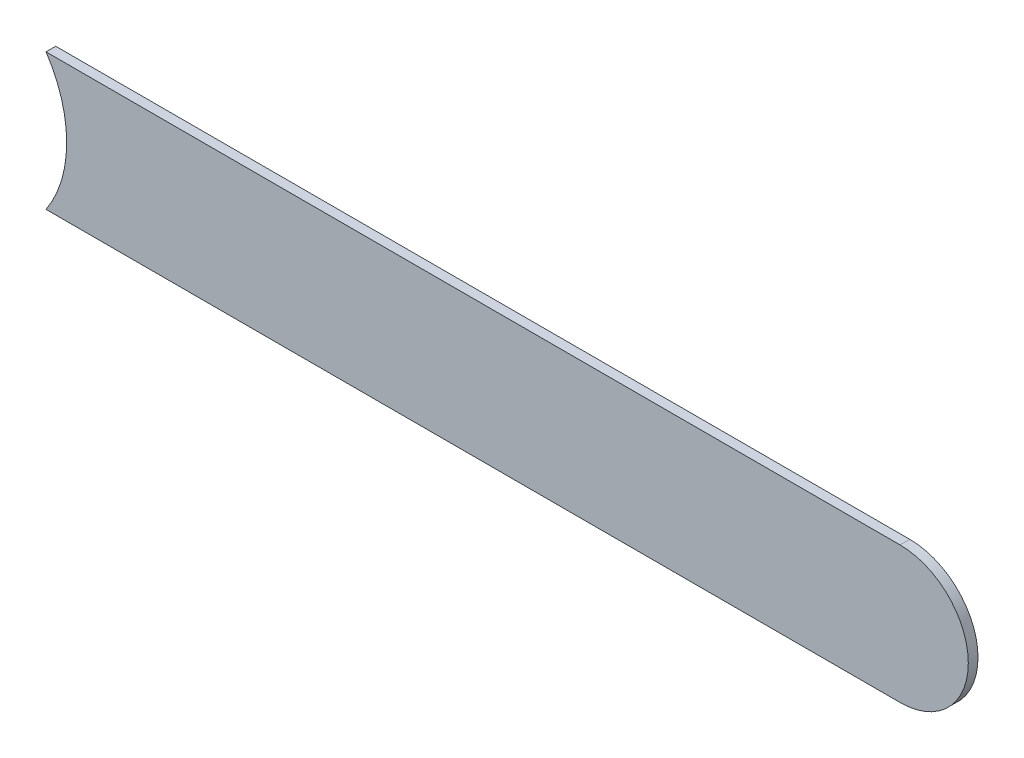
ISO-10303-21;
HEADER;
FILE_DESCRIPTION(('STEP AP214'),'2;1');
FILE_NAME('part.step','',(''),(''),'','','');
FILE_SCHEMA(('AUTOMOTIVE_DESIGN { 1 0 10303 214 1 1 1 1 }'));
ENDSEC;
DATA;
#1=APPLICATION_CONTEXT('core data for automotive mechanical design processes');
#2=APPLICATION_PROTOCOL_DEFINITION('international standard','automotive_design',2000,#1);
#3=PRODUCT_CONTEXT('',#1,'mechanical');
#4=PRODUCT('Part','Part','',(#3));
#5=PRODUCT_RELATED_PRODUCT_CATEGORY('part','',(#4));
#6=PRODUCT_DEFINITION_FORMATION('','',#4);
#7=PRODUCT_DEFINITION_CONTEXT('part definition',#1,'design');
#8=PRODUCT_DEFINITION('design','',#6,#7);
#9=PRODUCT_DEFINITION_SHAPE('','',#8);
#10=(LENGTH_UNIT() NAMED_UNIT(*) SI_UNIT(.MILLI.,.METRE.));
#11=(NAMED_UNIT(*) PLANE_ANGLE_UNIT() SI_UNIT($,.RADIAN.));
#12=(NAMED_UNIT(*) SI_UNIT($,.STERADIAN.) SOLID_ANGLE_UNIT());
#13=UNCERTAINTY_MEASURE_WITH_UNIT(LENGTH_MEASURE(1.E-05),#10,'distance_accuracy_value','');
#14=(GEOMETRIC_REPRESENTATION_CONTEXT(3) GLOBAL_UNCERTAINTY_ASSIGNED_CONTEXT((#13)) GLOBAL_UNIT_ASSIGNED_CONTEXT((#10,
#11,#12)) REPRESENTATION_CONTEXT('',''));
#15=CARTESIAN_POINT('',(0.,0.,0.));
#16=DIRECTION('',(0.,0.,1.));
#17=DIRECTION('',(1.,0.,0.));
#18=AXIS2_PLACEMENT_3D('',#15,#16,#17);
#19=CARTESIAN_POINT('',(80.2741829903459,82.4500129,0.));
#20=DIRECTION('',(0.,1.,0.));
#21=DIRECTION('',(1.,0.,0.));
#22=AXIS2_PLACEMENT_3D('',#19,#20,#21);
#23=PLANE('',#22);
#24=DIRECTION('',(1.,0.,0.));
#25=VECTOR('',#24,1.);
#26=CARTESIAN_POINT('',(79.900018,82.4500129,0.03556));
#27=LINE('',#26,#25);
#28=CARTESIAN_POINT('',(80.2741829903459,82.4500129,0.03556));
#29=VERTEX_POINT('',#28);
#30=CARTESIAN_POINT('',(83.403186,82.4500129,0.03556));
#31=VERTEX_POINT('',#30);
#32=EDGE_CURVE('E11',#29,#31,#27,.T.);
#33=ORIENTED_EDGE('',*,*,#32,.F.);
#34=DIRECTION('',(0.,0.,1.));
#35=VECTOR('',#34,1.);
#36=CARTESIAN_POINT('',(80.2741829903459,82.4500129,0.));
#37=LINE('',#36,#35);
#38=CARTESIAN_POINT('',(80.2741829903459,82.4500129,0.));
#39=VERTEX_POINT('',#38);
#40=EDGE_CURVE('E24',#39,#29,#37,.T.);
#41=ORIENTED_EDGE('',*,*,#40,.F.);
#42=DIRECTION('',(1.,0.,0.));
#43=VECTOR('',#42,1.);
#44=CARTESIAN_POINT('',(79.900018,82.4500129,0.));
#45=LINE('',#44,#43);
#46=CARTESIAN_POINT('',(83.403186,82.4500129,0.));
#47=VERTEX_POINT('',#46);
#48=EDGE_CURVE('E82',#39,#47,#45,.T.);
#49=ORIENTED_EDGE('',*,*,#48,.T.);
#50=DIRECTION('',(0.,0.,1.));
#51=VECTOR('',#50,1.);
#52=CARTESIAN_POINT('',(83.403186,82.4500129,0.));
#53=LINE('',#52,#51);
#54=EDGE_CURVE('E37',#47,#31,#53,.T.);
#55=ORIENTED_EDGE('',*,*,#54,.T.);
#56=EDGE_LOOP('',(#33,#41,#49,#55));
#57=FACE_BOUND('',#56,.T.);
#58=ADVANCED_FACE('F17',(#57),#23,.F.);
#59=CARTESIAN_POINT('',(83.403186,82.7000124,0.));
#60=DIRECTION('',(0.,0.,-1.));
#61=DIRECTION('',(0.,-1.,0.));
#62=AXIS2_PLACEMENT_3D('',#59,#60,#61);
#63=CYLINDRICAL_SURFACE('',#62,0.249999500000001);
#64=CARTESIAN_POINT('',(83.403186,82.7000124,0.03556));
#65=DIRECTION('',(0.,0.,1.));
#66=DIRECTION('',(0.,-1.,0.));
#67=AXIS2_PLACEMENT_3D('',#64,#65,#66);
#68=CIRCLE('',#67,0.249999500000001);
#69=CARTESIAN_POINT('',(83.403186,82.9500119,0.03556));
#70=VERTEX_POINT('',#69);
#71=EDGE_CURVE('E97',#31,#70,#68,.T.);
#72=ORIENTED_EDGE('',*,*,#71,.F.);
#73=ORIENTED_EDGE('',*,*,#54,.F.);
#74=CARTESIAN_POINT('',(83.403186,82.7000124,0.));
#75=DIRECTION('',(0.,0.,1.));
#76=DIRECTION('',(0.,-1.,0.));
#77=AXIS2_PLACEMENT_3D('',#74,#75,#76);
#78=CIRCLE('',#77,0.249999500000001);
#79=CARTESIAN_POINT('',(83.403186,82.9500119,0.));
#80=VERTEX_POINT('',#79);
#81=EDGE_CURVE('E94',#47,#80,#78,.T.);
#82=ORIENTED_EDGE('',*,*,#81,.T.);
#83=DIRECTION('',(0.,0.,1.));
#84=VECTOR('',#83,1.);
#85=CARTESIAN_POINT('',(83.403186,82.9500119,0.));
#86=LINE('',#85,#84);
#87=EDGE_CURVE('E92',#80,#70,#86,.T.);
#88=ORIENTED_EDGE('',*,*,#87,.T.);
#89=EDGE_LOOP('',(#72,#73,#82,#88));
#90=FACE_BOUND('',#89,.T.);
#91=ADVANCED_FACE('F103',(#90),#63,.T.);
#92=CARTESIAN_POINT('',(83.403186,82.9500119,0.));
#93=DIRECTION('',(0.,-1.,0.));
#94=DIRECTION('',(-1.,0.,0.));
#95=AXIS2_PLACEMENT_3D('',#92,#93,#94);
#96=PLANE('',#95);
#97=DIRECTION('',(-1.,0.,0.));
#98=VECTOR('',#97,1.);
#99=CARTESIAN_POINT('',(83.403186,82.9500119,0.03556));
#100=LINE('',#99,#98);
#101=CARTESIAN_POINT('',(80.2741829903459,82.9500119,0.03556));
#102=VERTEX_POINT('',#101);
#103=EDGE_CURVE('E89',#70,#102,#100,.T.);
#104=ORIENTED_EDGE('',*,*,#103,.F.);
#105=ORIENTED_EDGE('',*,*,#87,.F.);
#106=DIRECTION('',(-1.,0.,0.));
#107=VECTOR('',#106,1.);
#108=CARTESIAN_POINT('',(83.403186,82.9500119,0.));
#109=LINE('',#108,#107);
#110=CARTESIAN_POINT('',(80.2741829903459,82.9500119,0.));
#111=VERTEX_POINT('',#110);
#112=EDGE_CURVE('E87',#80,#111,#109,.T.);
#113=ORIENTED_EDGE('',*,*,#112,.T.);
#114=DIRECTION('',(0.,0.,1.));
#115=VECTOR('',#114,1.);
#116=CARTESIAN_POINT('',(80.2741829903459,82.9500119,0.));
#117=LINE('',#116,#115);
#118=EDGE_CURVE('E69',#111,#102,#117,.T.);
#119=ORIENTED_EDGE('',*,*,#118,.T.);
#120=EDGE_LOOP('',(#104,#105,#113,#119));
#121=FACE_BOUND('',#120,.T.);
#122=ADVANCED_FACE('F108',(#121),#96,.F.);
#123=CARTESIAN_POINT('',(79.900018,82.7000124,0.));
#124=DIRECTION('',(0.,0.,-1.));
#125=DIRECTION('',(1.,0.,0.));
#126=AXIS2_PLACEMENT_3D('',#123,#124,#125);
#127=CYLINDRICAL_SURFACE('',#126,0.4499991);
#128=DIRECTION('',(0.,0.,1.));
#129=VECTOR('',#128,1.);
#130=CARTESIAN_POINT('',(80.3500171,82.7000124,0.));
#131=LINE('',#130,#129);
#132=CARTESIAN_POINT('',(80.3500171,82.7000124,0.));
#133=VERTEX_POINT('',#132);
#134=CARTESIAN_POINT('',(80.3500171,82.7000124,0.03556));
#135=VERTEX_POINT('',#134);
#136=EDGE_CURVE('E59',#133,#135,#131,.T.);
#137=ORIENTED_EDGE('',*,*,#136,.T.);
#138=CARTESIAN_POINT('',(79.900018,82.7000124,0.03556));
#139=DIRECTION('',(0.,0.,1.));
#140=DIRECTION('',(1.,0.,0.));
#141=AXIS2_PLACEMENT_3D('',#138,#139,#140);
#142=CIRCLE('',#141,0.4499991);
#143=EDGE_CURVE('E70',#135,#102,#142,.T.);
#144=ORIENTED_EDGE('',*,*,#143,.T.);
#145=ORIENTED_EDGE('',*,*,#118,.F.);
#146=CARTESIAN_POINT('',(79.900018,82.7000124,0.));
#147=DIRECTION('',(0.,0.,1.));
#148=DIRECTION('',(1.,0.,0.));
#149=AXIS2_PLACEMENT_3D('',#146,#147,#148);
#150=CIRCLE('',#149,0.4499991);
#151=EDGE_CURVE('E73',#133,#111,#150,.T.);
#152=ORIENTED_EDGE('',*,*,#151,.F.);
#153=EDGE_LOOP('',(#137,#144,#145,#152));
#154=FACE_BOUND('',#153,.T.);
#155=ADVANCED_FACE('F74',(#154),#127,.F.);
#156=CARTESIAN_POINT('',(79.900018,82.7000124,0.));
#157=DIRECTION('',(0.,0.,-1.));
#158=DIRECTION('',(1.,0.,0.));
#159=AXIS2_PLACEMENT_3D('',#156,#157,#158);
#160=CYLINDRICAL_SURFACE('',#159,0.4499991);
#161=ORIENTED_EDGE('',*,*,#40,.T.);
#162=CARTESIAN_POINT('',(79.900018,82.7000124,0.03556));
#163=DIRECTION('',(0.,0.,1.));
#164=DIRECTION('',(1.,0.,0.));
#165=AXIS2_PLACEMENT_3D('',#162,#163,#164);
#166=CIRCLE('',#165,0.4499991);
#167=EDGE_CURVE('E65',#29,#135,#166,.T.);
#168=ORIENTED_EDGE('',*,*,#167,.T.);
#169=ORIENTED_EDGE('',*,*,#136,.F.);
#170=EDGE_CURVE('E63',#39,#133,#150,.T.);
#171=ORIENTED_EDGE('',*,*,#170,.F.);
#172=EDGE_LOOP('',(#161,#168,#169,#171));
#173=FACE_BOUND('',#172,.T.);
#174=ADVANCED_FACE('F61',(#173),#160,.F.);
#175=CARTESIAN_POINT('',(79.900018,82.4500129,0.));
#176=DIRECTION('',(0.,0.,-1.));
#177=DIRECTION('',(-1.,0.,0.));
#178=AXIS2_PLACEMENT_3D('',#175,#176,#177);
#179=PLANE('',#178);
#180=ORIENTED_EDGE('',*,*,#48,.F.);
#181=ORIENTED_EDGE('',*,*,#170,.T.);
#182=ORIENTED_EDGE('',*,*,#151,.T.);
#183=ORIENTED_EDGE('',*,*,#112,.F.);
#184=ORIENTED_EDGE('',*,*,#81,.F.);
#185=EDGE_LOOP('',(#180,#181,#182,#183,#184));
#186=FACE_BOUND('',#185,.T.);
#187=ADVANCED_FACE('F80',(#186),#179,.T.);
#188=CARTESIAN_POINT('',(79.900018,82.4500129,0.03556));
#189=DIRECTION('',(0.,0.,-1.));
#190=DIRECTION('',(-1.,0.,0.));
#191=AXIS2_PLACEMENT_3D('',#188,#189,#190);
#192=PLANE('',#191);
#193=ORIENTED_EDGE('',*,*,#167,.F.);
#194=ORIENTED_EDGE('',*,*,#32,.T.);
#195=ORIENTED_EDGE('',*,*,#71,.T.);
#196=ORIENTED_EDGE('',*,*,#103,.T.);
#197=ORIENTED_EDGE('',*,*,#143,.F.);
#198=EDGE_LOOP('',(#193,#194,#195,#196,#197));
#199=FACE_BOUND('',#198,.T.);
#200=ADVANCED_FACE('F106',(#199),#192,.F.);
#201=CLOSED_SHELL('',(#58,#91,#122,#155,#174,#187,#200));
#202=MANIFOLD_SOLID_BREP('B1',#201);
#203=ADVANCED_BREP_SHAPE_REPRESENTATION('',(#18,#202),#14);
#204=SHAPE_DEFINITION_REPRESENTATION(#9,#203);
ENDSEC;
END-ISO-10303-21;
